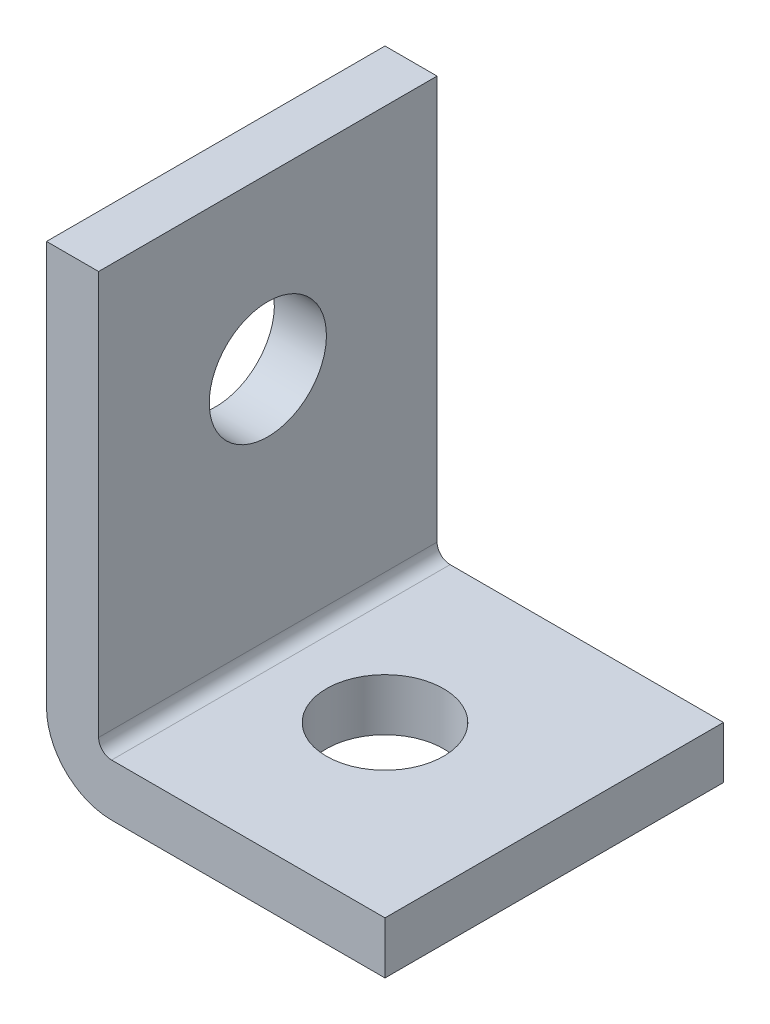
ISO-10303-21;
HEADER;
FILE_DESCRIPTION(('STEP AP214'),'2;1');
FILE_NAME('part.step','',(''),(''),'','','');
FILE_SCHEMA(('AUTOMOTIVE_DESIGN { 1 0 10303 214 1 1 1 1 }'));
ENDSEC;
DATA;
#1=APPLICATION_CONTEXT('core data for automotive mechanical design processes');
#2=APPLICATION_PROTOCOL_DEFINITION('international standard','automotive_design',2000,#1);
#3=PRODUCT_CONTEXT('',#1,'mechanical');
#4=PRODUCT('Part','Part','',(#3));
#5=PRODUCT_RELATED_PRODUCT_CATEGORY('part','',(#4));
#6=PRODUCT_DEFINITION_FORMATION('','',#4);
#7=PRODUCT_DEFINITION_CONTEXT('part definition',#1,'design');
#8=PRODUCT_DEFINITION('design','',#6,#7);
#9=PRODUCT_DEFINITION_SHAPE('','',#8);
#10=(LENGTH_UNIT() NAMED_UNIT(*) SI_UNIT(.MILLI.,.METRE.));
#11=(NAMED_UNIT(*) PLANE_ANGLE_UNIT() SI_UNIT($,.RADIAN.));
#12=(NAMED_UNIT(*) SI_UNIT($,.STERADIAN.) SOLID_ANGLE_UNIT());
#13=UNCERTAINTY_MEASURE_WITH_UNIT(LENGTH_MEASURE(1.E-05),#10,'distance_accuracy_value','');
#14=(GEOMETRIC_REPRESENTATION_CONTEXT(3) GLOBAL_UNCERTAINTY_ASSIGNED_CONTEXT((#13)) GLOBAL_UNIT_ASSIGNED_CONTEXT((#10,
#11,#12)) REPRESENTATION_CONTEXT('',''));
#15=CARTESIAN_POINT('',(0.,0.,0.));
#16=DIRECTION('',(0.,0.,1.));
#17=DIRECTION('',(1.,0.,0.));
#18=AXIS2_PLACEMENT_3D('',#15,#16,#17);
#19=CARTESIAN_POINT('',(7.93750000000015,4.5102810375397E-13,20.6375000000003));
#20=DIRECTION('',(0.,1.,0.));
#21=DIRECTION('',(0.,0.,1.));
#22=AXIS2_PLACEMENT_3D('',#19,#20,#21);
#23=PLANE('',#22);
#24=CARTESIAN_POINT('',(20.6374999999999,0.,0.));
#25=DIRECTION('',(0.,1.,0.));
#26=DIRECTION('',(0.,0.,1.));
#27=AXIS2_PLACEMENT_3D('',#24,#25,#26);
#28=CIRCLE('',#27,7.14375);
#29=CARTESIAN_POINT('',(20.6374999999999,0.,7.14375));
#30=VERTEX_POINT('',#29);
#31=EDGE_CURVE('E133',#30,#30,#28,.T.);
#32=ORIENTED_EDGE('',*,*,#31,.T.);
#33=EDGE_LOOP('',(#32));
#34=FACE_BOUND('',#33,.T.);
#35=DIRECTION('',(1.,0.,0.));
#36=VECTOR('',#35,1.);
#37=CARTESIAN_POINT('',(7.93750000000015,0.,-20.6375000000003));
#38=LINE('',#37,#36);
#39=CARTESIAN_POINT('',(7.93750000000015,0.,-20.6375000000003));
#40=VERTEX_POINT('',#39);
#41=CARTESIAN_POINT('',(41.2750000000002,0.,-20.6375000000003));
#42=VERTEX_POINT('',#41);
#43=EDGE_CURVE('E129',#40,#42,#38,.T.);
#44=ORIENTED_EDGE('',*,*,#43,.T.);
#45=DIRECTION('',(0.,0.,-1.));
#46=VECTOR('',#45,1.);
#47=CARTESIAN_POINT('',(41.2750000000002,4.5102810375397E-13,20.6375000000003));
#48=LINE('',#47,#46);
#49=CARTESIAN_POINT('',(41.2750000000002,4.5102810375397E-13,20.6375000000003));
#50=VERTEX_POINT('',#49);
#51=EDGE_CURVE('E11',#50,#42,#48,.T.);
#52=ORIENTED_EDGE('',*,*,#51,.F.);
#53=DIRECTION('',(1.,0.,0.));
#54=VECTOR('',#53,1.);
#55=CARTESIAN_POINT('',(7.93750000000015,4.5102810375397E-13,20.6375000000003));
#56=LINE('',#55,#54);
#57=CARTESIAN_POINT('',(7.93750000000015,4.5102810375397E-13,20.6375000000003));
#58=VERTEX_POINT('',#57);
#59=EDGE_CURVE('E87',#58,#50,#56,.T.);
#60=ORIENTED_EDGE('',*,*,#59,.F.);
#61=DIRECTION('',(0.,0.,-1.));
#62=VECTOR('',#61,1.);
#63=CARTESIAN_POINT('',(7.93750000000015,4.5102810375397E-13,20.6375000000003));
#64=LINE('',#63,#62);
#65=EDGE_CURVE('E128',#58,#40,#64,.T.);
#66=ORIENTED_EDGE('',*,*,#65,.T.);
#67=EDGE_LOOP('',(#44,#52,#60,#66));
#68=FACE_BOUND('',#67,.T.);
#69=ADVANCED_FACE('F32',(#34,#68),#23,.F.);
#70=CARTESIAN_POINT('',(41.2750000000002,6.35000000000031,20.6375000000003));
#71=DIRECTION('',(1.,0.,0.));
#72=DIRECTION('',(0.,0.,-1.));
#73=AXIS2_PLACEMENT_3D('',#70,#71,#72);
#74=PLANE('',#73);
#75=DIRECTION('',(0.,-1.,0.));
#76=VECTOR('',#75,1.);
#77=CARTESIAN_POINT('',(41.2750000000002,6.35000000000008,-20.6375000000003));
#78=LINE('',#77,#76);
#79=CARTESIAN_POINT('',(41.2750000000002,6.35000000000008,-20.6375000000003));
#80=VERTEX_POINT('',#79);
#81=EDGE_CURVE('E132',#80,#42,#78,.T.);
#82=ORIENTED_EDGE('',*,*,#81,.F.);
#83=DIRECTION('',(0.,0.,-1.));
#84=VECTOR('',#83,1.);
#85=CARTESIAN_POINT('',(41.2750000000002,6.35000000000031,20.6375000000003));
#86=LINE('',#85,#84);
#87=CARTESIAN_POINT('',(41.2750000000002,6.35000000000031,20.6375000000003));
#88=VERTEX_POINT('',#87);
#89=EDGE_CURVE('E40',#88,#80,#86,.T.);
#90=ORIENTED_EDGE('',*,*,#89,.F.);
#91=DIRECTION('',(0.,-1.,0.));
#92=VECTOR('',#91,1.);
#93=CARTESIAN_POINT('',(41.2750000000002,6.35000000000031,20.6375000000003));
#94=LINE('',#93,#92);
#95=EDGE_CURVE('E172',#88,#50,#94,.T.);
#96=ORIENTED_EDGE('',*,*,#95,.T.);
#97=ORIENTED_EDGE('',*,*,#51,.T.);
#98=EDGE_LOOP('',(#82,#90,#96,#97));
#99=FACE_BOUND('',#98,.T.);
#100=ADVANCED_FACE('F163',(#99),#74,.T.);
#101=CARTESIAN_POINT('',(7.93750000000015,6.35000000000031,20.6375000000003));
#102=DIRECTION('',(0.,1.,0.));
#103=DIRECTION('',(0.,0.,1.));
#104=AXIS2_PLACEMENT_3D('',#101,#102,#103);
#105=PLANE('',#104);
#106=CARTESIAN_POINT('',(20.6374999999999,6.35000000000008,0.));
#107=DIRECTION('',(0.,1.,0.));
#108=DIRECTION('',(0.,0.,1.));
#109=AXIS2_PLACEMENT_3D('',#106,#107,#108);
#110=CIRCLE('',#109,7.14375);
#111=CARTESIAN_POINT('',(20.6374999999999,6.35000000000008,7.14375));
#112=VERTEX_POINT('',#111);
#113=EDGE_CURVE('E177',#112,#112,#110,.T.);
#114=ORIENTED_EDGE('',*,*,#113,.F.);
#115=EDGE_LOOP('',(#114));
#116=FACE_BOUND('',#115,.T.);
#117=DIRECTION('',(1.,0.,0.));
#118=VECTOR('',#117,1.);
#119=CARTESIAN_POINT('',(7.93750000000015,6.35000000000008,-20.6375000000003));
#120=LINE('',#119,#118);
#121=CARTESIAN_POINT('',(7.93750000000015,6.35000000000008,-20.6375000000003));
#122=VERTEX_POINT('',#121);
#123=EDGE_CURVE('E136',#122,#80,#120,.T.);
#124=ORIENTED_EDGE('',*,*,#123,.F.);
#125=DIRECTION('',(0.,0.,-1.));
#126=VECTOR('',#125,1.);
#127=CARTESIAN_POINT('',(7.93750000000015,6.35000000000031,20.6375000000003));
#128=LINE('',#127,#126);
#129=CARTESIAN_POINT('',(7.93750000000015,6.35000000000031,20.6375000000003));
#130=VERTEX_POINT('',#129);
#131=EDGE_CURVE('E153',#130,#122,#128,.T.);
#132=ORIENTED_EDGE('',*,*,#131,.F.);
#133=DIRECTION('',(1.,0.,0.));
#134=VECTOR('',#133,1.);
#135=CARTESIAN_POINT('',(7.93750000000015,6.35000000000031,20.6375000000003));
#136=LINE('',#135,#134);
#137=EDGE_CURVE('E160',#130,#88,#136,.T.);
#138=ORIENTED_EDGE('',*,*,#137,.T.);
#139=ORIENTED_EDGE('',*,*,#89,.T.);
#140=EDGE_LOOP('',(#124,#132,#138,#139));
#141=FACE_BOUND('',#140,.T.);
#142=ADVANCED_FACE('F158',(#116,#141),#105,.T.);
#143=CARTESIAN_POINT('',(7.93750000000015,7.93750000000038,20.6375000000003));
#144=DIRECTION('',(0.,0.,-1.));
#145=DIRECTION('',(-1.,0.,0.));
#146=AXIS2_PLACEMENT_3D('',#143,#144,#145);
#147=CYLINDRICAL_SURFACE('',#146,1.5875);
#148=CARTESIAN_POINT('',(7.93750000000015,7.93750000000015,-20.6375000000003));
#149=DIRECTION('',(0.,0.,1.));
#150=DIRECTION('',(1.,0.,0.));
#151=AXIS2_PLACEMENT_3D('',#148,#149,#150);
#152=CIRCLE('',#151,1.5875);
#153=CARTESIAN_POINT('',(6.34999999999986,7.93750000000015,-20.6375000000003));
#154=VERTEX_POINT('',#153);
#155=EDGE_CURVE('E139',#154,#122,#152,.T.);
#156=ORIENTED_EDGE('',*,*,#155,.F.);
#157=DIRECTION('',(0.,0.,-1.));
#158=VECTOR('',#157,1.);
#159=CARTESIAN_POINT('',(6.34999999999986,7.93750000000038,20.6375000000003));
#160=LINE('',#159,#158);
#161=CARTESIAN_POINT('',(6.34999999999986,7.93750000000038,20.6375000000003));
#162=VERTEX_POINT('',#161);
#163=EDGE_CURVE('E151',#162,#154,#160,.T.);
#164=ORIENTED_EDGE('',*,*,#163,.F.);
#165=CARTESIAN_POINT('',(7.93750000000015,7.93750000000038,20.6375000000003));
#166=DIRECTION('',(0.,0.,1.));
#167=DIRECTION('',(1.,0.,0.));
#168=AXIS2_PLACEMENT_3D('',#165,#166,#167);
#169=CIRCLE('',#168,1.5875);
#170=EDGE_CURVE('E123',#162,#130,#169,.T.);
#171=ORIENTED_EDGE('',*,*,#170,.T.);
#172=ORIENTED_EDGE('',*,*,#131,.T.);
#173=EDGE_LOOP('',(#156,#164,#171,#172));
#174=FACE_BOUND('',#173,.T.);
#175=ADVANCED_FACE('F170',(#174),#147,.F.);
#176=CARTESIAN_POINT('',(6.34999999999986,57.1500000000003,20.6375000000003));
#177=DIRECTION('',(1.,0.,0.));
#178=DIRECTION('',(0.,1.,0.));
#179=AXIS2_PLACEMENT_3D('',#176,#177,#178);
#180=PLANE('',#179);
#181=CARTESIAN_POINT('',(6.34999999999986,36.5125,0.));
#182=DIRECTION('',(1.,0.,0.));
#183=DIRECTION('',(0.,1.,0.));
#184=AXIS2_PLACEMENT_3D('',#181,#182,#183);
#185=CIRCLE('',#184,7.14375);
#186=CARTESIAN_POINT('',(6.34999999999985,43.65625,0.));
#187=VERTEX_POINT('',#186);
#188=EDGE_CURVE('E183',#187,#187,#185,.T.);
#189=ORIENTED_EDGE('',*,*,#188,.F.);
#190=EDGE_LOOP('',(#189));
#191=FACE_BOUND('',#190,.T.);
#192=DIRECTION('',(0.,-1.,0.));
#193=VECTOR('',#192,1.);
#194=CARTESIAN_POINT('',(6.34999999999986,57.15,-20.6374999999994));
#195=LINE('',#194,#193);
#196=CARTESIAN_POINT('',(6.34999999999986,57.15,-20.6374999999994));
#197=VERTEX_POINT('',#196);
#198=EDGE_CURVE('E142',#197,#154,#195,.T.);
#199=ORIENTED_EDGE('',*,*,#198,.F.);
#200=DIRECTION('',(0.,0.,-1.));
#201=VECTOR('',#200,1.);
#202=CARTESIAN_POINT('',(6.34999999999986,57.1500000000003,20.6375000000003));
#203=LINE('',#202,#201);
#204=CARTESIAN_POINT('',(6.34999999999986,57.1500000000003,20.6375000000003));
#205=VERTEX_POINT('',#204);
#206=EDGE_CURVE('E111',#205,#197,#203,.T.);
#207=ORIENTED_EDGE('',*,*,#206,.F.);
#208=DIRECTION('',(0.,-1.,0.));
#209=VECTOR('',#208,1.);
#210=CARTESIAN_POINT('',(6.34999999999986,57.1500000000003,20.6375000000003));
#211=LINE('',#210,#209);
#212=EDGE_CURVE('E121',#205,#162,#211,.T.);
#213=ORIENTED_EDGE('',*,*,#212,.T.);
#214=ORIENTED_EDGE('',*,*,#163,.T.);
#215=EDGE_LOOP('',(#199,#207,#213,#214));
#216=FACE_BOUND('',#215,.T.);
#217=ADVANCED_FACE('F197',(#191,#216),#180,.T.);
#218=CARTESIAN_POINT('',(0.,57.1500000000003,20.6375000000003));
#219=DIRECTION('',(0.,1.,0.));
#220=DIRECTION('',(0.,0.,1.));
#221=AXIS2_PLACEMENT_3D('',#218,#219,#220);
#222=PLANE('',#221);
#223=DIRECTION('',(1.,0.,0.));
#224=VECTOR('',#223,1.);
#225=CARTESIAN_POINT('',(0.,57.15,-20.6374999999994));
#226=LINE('',#225,#224);
#227=CARTESIAN_POINT('',(0.,57.15,-20.6374999999994));
#228=VERTEX_POINT('',#227);
#229=EDGE_CURVE('E110',#228,#197,#226,.T.);
#230=ORIENTED_EDGE('',*,*,#229,.F.);
#231=DIRECTION('',(0.,0.,-1.));
#232=VECTOR('',#231,1.);
#233=CARTESIAN_POINT('',(0.,57.1500000000003,20.6375000000003));
#234=LINE('',#233,#232);
#235=CARTESIAN_POINT('',(0.,57.1500000000003,20.6375000000003));
#236=VERTEX_POINT('',#235);
#237=EDGE_CURVE('E104',#236,#228,#234,.T.);
#238=ORIENTED_EDGE('',*,*,#237,.F.);
#239=DIRECTION('',(1.,0.,0.));
#240=VECTOR('',#239,1.);
#241=CARTESIAN_POINT('',(0.,57.1500000000003,20.6375000000003));
#242=LINE('',#241,#240);
#243=EDGE_CURVE('E108',#236,#205,#242,.T.);
#244=ORIENTED_EDGE('',*,*,#243,.T.);
#245=ORIENTED_EDGE('',*,*,#206,.T.);
#246=EDGE_LOOP('',(#230,#238,#244,#245));
#247=FACE_BOUND('',#246,.T.);
#248=ADVANCED_FACE('F106',(#247),#222,.T.);
#249=CARTESIAN_POINT('',(0.,57.1500000000003,20.6375000000003));
#250=DIRECTION('',(1.,0.,0.));
#251=DIRECTION('',(0.,1.,0.));
#252=AXIS2_PLACEMENT_3D('',#249,#250,#251);
#253=PLANE('',#252);
#254=CARTESIAN_POINT('',(0.,36.5125,0.));
#255=DIRECTION('',(1.,0.,0.));
#256=DIRECTION('',(0.,1.,0.));
#257=AXIS2_PLACEMENT_3D('',#254,#255,#256);
#258=CIRCLE('',#257,7.14375);
#259=CARTESIAN_POINT('',(0.,43.65625,0.));
#260=VERTEX_POINT('',#259);
#261=EDGE_CURVE('E180',#260,#260,#258,.T.);
#262=ORIENTED_EDGE('',*,*,#261,.T.);
#263=EDGE_LOOP('',(#262));
#264=FACE_BOUND('',#263,.T.);
#265=DIRECTION('',(0.,-1.,0.));
#266=VECTOR('',#265,1.);
#267=CARTESIAN_POINT('',(0.,57.15,-20.6374999999994));
#268=LINE('',#267,#266);
#269=CARTESIAN_POINT('',(0.,7.93750000000015,-20.6375000000003));
#270=VERTEX_POINT('',#269);
#271=EDGE_CURVE('E75',#228,#270,#268,.T.);
#272=ORIENTED_EDGE('',*,*,#271,.T.);
#273=DIRECTION('',(0.,0.,-1.));
#274=VECTOR('',#273,1.);
#275=CARTESIAN_POINT('',(0.,7.93750000000038,20.6375000000003));
#276=LINE('',#275,#274);
#277=CARTESIAN_POINT('',(0.,7.93750000000038,20.6375000000003));
#278=VERTEX_POINT('',#277);
#279=EDGE_CURVE('E112',#278,#270,#276,.T.);
#280=ORIENTED_EDGE('',*,*,#279,.F.);
#281=DIRECTION('',(0.,-1.,0.));
#282=VECTOR('',#281,1.);
#283=CARTESIAN_POINT('',(0.,57.1500000000003,20.6375000000003));
#284=LINE('',#283,#282);
#285=EDGE_CURVE('E114',#236,#278,#284,.T.);
#286=ORIENTED_EDGE('',*,*,#285,.F.);
#287=ORIENTED_EDGE('',*,*,#237,.T.);
#288=EDGE_LOOP('',(#272,#280,#286,#287));
#289=FACE_BOUND('',#288,.T.);
#290=ADVANCED_FACE('F115',(#264,#289),#253,.F.);
#291=CARTESIAN_POINT('',(7.93750000000015,7.93750000000038,20.6375000000003));
#292=DIRECTION('',(0.,0.,-1.));
#293=DIRECTION('',(-1.,0.,0.));
#294=AXIS2_PLACEMENT_3D('',#291,#292,#293);
#295=CYLINDRICAL_SURFACE('',#294,7.9375);
#296=CARTESIAN_POINT('',(7.93750000000015,7.93750000000015,-20.6375000000003));
#297=DIRECTION('',(0.,0.,1.));
#298=DIRECTION('',(1.,0.,0.));
#299=AXIS2_PLACEMENT_3D('',#296,#297,#298);
#300=CIRCLE('',#299,7.9375);
#301=EDGE_CURVE('E81',#270,#40,#300,.T.);
#302=ORIENTED_EDGE('',*,*,#301,.T.);
#303=ORIENTED_EDGE('',*,*,#65,.F.);
#304=CARTESIAN_POINT('',(7.93750000000015,7.93750000000038,20.6375000000003));
#305=DIRECTION('',(0.,0.,1.));
#306=DIRECTION('',(1.,0.,0.));
#307=AXIS2_PLACEMENT_3D('',#304,#305,#306);
#308=CIRCLE('',#307,7.9375);
#309=EDGE_CURVE('E48',#278,#58,#308,.T.);
#310=ORIENTED_EDGE('',*,*,#309,.F.);
#311=ORIENTED_EDGE('',*,*,#279,.T.);
#312=EDGE_LOOP('',(#302,#303,#310,#311));
#313=FACE_BOUND('',#312,.T.);
#314=ADVANCED_FACE('F202',(#313),#295,.T.);
#315=CARTESIAN_POINT('',(7.93750000000015,7.93750000000038,20.6375000000003));
#316=DIRECTION('',(0.,0.,1.));
#317=DIRECTION('',(1.,0.,0.));
#318=AXIS2_PLACEMENT_3D('',#315,#316,#317);
#319=PLANE('',#318);
#320=ORIENTED_EDGE('',*,*,#59,.T.);
#321=ORIENTED_EDGE('',*,*,#95,.F.);
#322=ORIENTED_EDGE('',*,*,#137,.F.);
#323=ORIENTED_EDGE('',*,*,#170,.F.);
#324=ORIENTED_EDGE('',*,*,#212,.F.);
#325=ORIENTED_EDGE('',*,*,#243,.F.);
#326=ORIENTED_EDGE('',*,*,#285,.T.);
#327=ORIENTED_EDGE('',*,*,#309,.T.);
#328=EDGE_LOOP('',(#320,#321,#322,#323,#324,#325,#326,#327));
#329=FACE_BOUND('',#328,.T.);
#330=ADVANCED_FACE('F118',(#329),#319,.T.);
#331=CARTESIAN_POINT('',(7.93750000000015,7.93750000000015,-20.6375000000003));
#332=DIRECTION('',(0.,0.,1.));
#333=DIRECTION('',(1.,0.,0.));
#334=AXIS2_PLACEMENT_3D('',#331,#332,#333);
#335=PLANE('',#334);
#336=ORIENTED_EDGE('',*,*,#43,.F.);
#337=ORIENTED_EDGE('',*,*,#301,.F.);
#338=ORIENTED_EDGE('',*,*,#271,.F.);
#339=ORIENTED_EDGE('',*,*,#229,.T.);
#340=ORIENTED_EDGE('',*,*,#198,.T.);
#341=ORIENTED_EDGE('',*,*,#155,.T.);
#342=ORIENTED_EDGE('',*,*,#123,.T.);
#343=ORIENTED_EDGE('',*,*,#81,.T.);
#344=EDGE_LOOP('',(#336,#337,#338,#339,#340,#341,#342,#343));
#345=FACE_BOUND('',#344,.T.);
#346=ADVANCED_FACE('F166',(#345),#335,.F.);
#347=CARTESIAN_POINT('',(20.6374999999999,0.,0.));
#348=DIRECTION('',(0.,1.,0.));
#349=DIRECTION('',(0.,0.,1.));
#350=AXIS2_PLACEMENT_3D('',#347,#348,#349);
#351=CYLINDRICAL_SURFACE('',#350,7.14375);
#352=ORIENTED_EDGE('',*,*,#31,.F.);
#353=EDGE_LOOP('',(#352));
#354=FACE_BOUND('',#353,.T.);
#355=ORIENTED_EDGE('',*,*,#113,.T.);
#356=EDGE_LOOP('',(#355));
#357=FACE_BOUND('',#356,.T.);
#358=ADVANCED_FACE('F193',(#354,#357),#351,.F.);
#359=CARTESIAN_POINT('',(0.,36.5125,0.));
#360=DIRECTION('',(1.,0.,0.));
#361=DIRECTION('',(0.,1.,0.));
#362=AXIS2_PLACEMENT_3D('',#359,#360,#361);
#363=CYLINDRICAL_SURFACE('',#362,7.14375);
#364=CARTESIAN_POINT('',(0.,43.65625,0.));
#365=CARTESIAN_POINT('',(0.0661458333333309,43.65625,0.));
#366=CARTESIAN_POINT('',(0.132291666666663,43.65625,0.));
#367=CARTESIAN_POINT('',(0.264583333333326,43.65625,0.));
#368=CARTESIAN_POINT('',(0.330729166666658,43.65625,0.));
#369=CARTESIAN_POINT('',(0.463020833333322,43.65625,0.));
#370=CARTESIAN_POINT('',(0.529166666666654,43.65625,0.));
#371=CARTESIAN_POINT('',(0.661458333333317,43.65625,0.));
#372=CARTESIAN_POINT('',(0.727604166666649,43.65625,0.));
#373=CARTESIAN_POINT('',(0.859895833333313,43.65625,0.));
#374=CARTESIAN_POINT('',(0.926041666666645,43.65625,0.));
#375=CARTESIAN_POINT('',(1.05833333333331,43.65625,0.));
#376=CARTESIAN_POINT('',(1.12447916666664,43.65625,0.));
#377=CARTESIAN_POINT('',(1.2567708333333,43.65625,0.));
#378=CARTESIAN_POINT('',(1.32291666666664,43.65625,0.));
#379=CARTESIAN_POINT('',(1.4552083333333,43.65625,0.));
#380=CARTESIAN_POINT('',(1.52135416666663,43.65625,0.));
#381=CARTESIAN_POINT('',(1.65364583333329,43.65625,0.));
#382=CARTESIAN_POINT('',(1.71979166666663,43.65625,0.));
#383=CARTESIAN_POINT('',(1.85208333333329,43.65625,0.));
#384=CARTESIAN_POINT('',(1.91822916666662,43.65625,0.));
#385=CARTESIAN_POINT('',(2.05052083333329,43.65625,0.));
#386=CARTESIAN_POINT('',(2.11666666666662,43.65625,0.));
#387=CARTESIAN_POINT('',(2.24895833333328,43.65625,0.));
#388=CARTESIAN_POINT('',(2.31510416666661,43.65625,0.));
#389=CARTESIAN_POINT('',(2.44739583333328,43.65625,0.));
#390=CARTESIAN_POINT('',(2.51354166666661,43.65625,0.));
#391=CARTESIAN_POINT('',(2.64583333333327,43.65625,0.));
#392=CARTESIAN_POINT('',(2.7119791666666,43.65625,0.));
#393=CARTESIAN_POINT('',(2.84427083333327,43.65625,0.));
#394=CARTESIAN_POINT('',(2.9104166666666,43.65625,0.));
#395=CARTESIAN_POINT('',(3.04270833333326,43.65625,0.));
#396=CARTESIAN_POINT('',(3.10885416666659,43.65625,0.));
#397=CARTESIAN_POINT('',(3.24114583333326,43.65625,0.));
#398=CARTESIAN_POINT('',(3.30729166666659,43.65625,0.));
#399=CARTESIAN_POINT('',(3.43958333333325,43.65625,0.));
#400=CARTESIAN_POINT('',(3.50572916666659,43.65625,0.));
#401=CARTESIAN_POINT('',(3.63802083333325,43.65625,0.));
#402=CARTESIAN_POINT('',(3.70416666666658,43.65625,0.));
#403=CARTESIAN_POINT('',(3.83645833333324,43.65625,0.));
#404=CARTESIAN_POINT('',(3.90260416666658,43.65625,0.));
#405=CARTESIAN_POINT('',(4.03489583333324,43.65625,0.));
#406=CARTESIAN_POINT('',(4.10104166666657,43.65625,0.));
#407=CARTESIAN_POINT('',(4.23333333333324,43.65625,0.));
#408=CARTESIAN_POINT('',(4.29947916666657,43.65625,0.));
#409=CARTESIAN_POINT('',(4.43177083333323,43.65625,0.));
#410=CARTESIAN_POINT('',(4.49791666666656,43.65625,0.));
#411=CARTESIAN_POINT('',(4.63020833333323,43.65625,0.));
#412=CARTESIAN_POINT('',(4.69635416666656,43.65625,0.));
#413=CARTESIAN_POINT('',(4.82864583333322,43.65625,0.));
#414=CARTESIAN_POINT('',(4.89479166666655,43.65625,0.));
#415=CARTESIAN_POINT('',(5.02708333333322,43.65625,0.));
#416=CARTESIAN_POINT('',(5.09322916666655,43.65625,0.));
#417=CARTESIAN_POINT('',(5.22552083333321,43.65625,0.));
#418=CARTESIAN_POINT('',(5.29166666666654,43.65625,0.));
#419=CARTESIAN_POINT('',(5.42395833333321,43.65625,0.));
#420=CARTESIAN_POINT('',(5.49010416666654,43.65625,0.));
#421=CARTESIAN_POINT('',(5.6223958333332,43.65625,0.));
#422=CARTESIAN_POINT('',(5.68854166666654,43.65625,0.));
#423=CARTESIAN_POINT('',(5.8208333333332,43.65625,0.));
#424=CARTESIAN_POINT('',(5.88697916666653,43.65625,0.));
#425=CARTESIAN_POINT('',(6.0192708333332,43.65625,0.));
#426=CARTESIAN_POINT('',(6.08541666666653,43.65625,0.));
#427=CARTESIAN_POINT('',(6.21770833333319,43.65625,0.));
#428=CARTESIAN_POINT('',(6.28385416666652,43.65625,0.));
#429=CARTESIAN_POINT('',(6.34999999999985,43.65625,0.));
#430=B_SPLINE_CURVE_WITH_KNOTS('',3,(#364,#365,#366,#367,#368,#369,#370,#371,#372,#373,#374,
#375,#376,#377,#378,#379,#380,#381,#382,#383,#384,#385,#386,#387,#388,#389,#390,#391,#392,#393,
#394,#395,#396,#397,#398,#399,#400,#401,#402,#403,#404,#405,#406,#407,#408,#409,#410,#411,#412,
#413,#414,#415,#416,#417,#418,#419,#420,#421,#422,#423,#424,#425,#426,#427,#428,#429),
.UNSPECIFIED.,.F.,.F.,(4,2,2,2,2,2,2,2,2,2,2,2,2,2,2,2,2,2,2,2,2,2,2,2,2,2,2,2,2,2,2,2,4),(0.,
0.198437499999995,0.396874999999991,0.595312499999986,0.793749999999982,0.992187499999977,
1.19062499999997,1.38906249999997,1.58749999999996,1.78593749999996,1.98437499999995,
2.18281249999995,2.38124999999995,2.57968749999994,2.77812499999994,2.97656249999993,
3.17499999999993,3.37343749999992,3.57187499999992,3.77031249999991,3.96874999999991,
4.1671874999999,4.3656249999999,4.5640624999999,4.76249999999989,4.96093749999989,
5.15937499999988,5.35781249999988,5.55624999999987,5.75468749999987,5.95312499999986,
6.15156249999986,6.34999999999985),.UNSPECIFIED.);
#431=EDGE_CURVE('BSEAM190',#260,#187,#430,.T.);
#432=ORIENTED_EDGE('',*,*,#261,.F.);
#433=ORIENTED_EDGE('',*,*,#188,.T.);
#434=ORIENTED_EDGE('',*,*,#431,.T.);
#435=ORIENTED_EDGE('',*,*,#431,.F.);
#436=EDGE_LOOP('',(#432,#434,#433,#435));
#437=FACE_BOUND('',#436,.T.);
#438=ADVANCED_FACE('F190',(#437),#363,.F.);
#439=CLOSED_SHELL('',(#69,#100,#142,#175,#217,#248,#290,#314,#330,#346,#358,#438));
#440=MANIFOLD_SOLID_BREP('B2',#439);
#441=ADVANCED_BREP_SHAPE_REPRESENTATION('',(#18,#440),#14);
#442=SHAPE_DEFINITION_REPRESENTATION(#9,#441);
ENDSEC;
END-ISO-10303-21;
